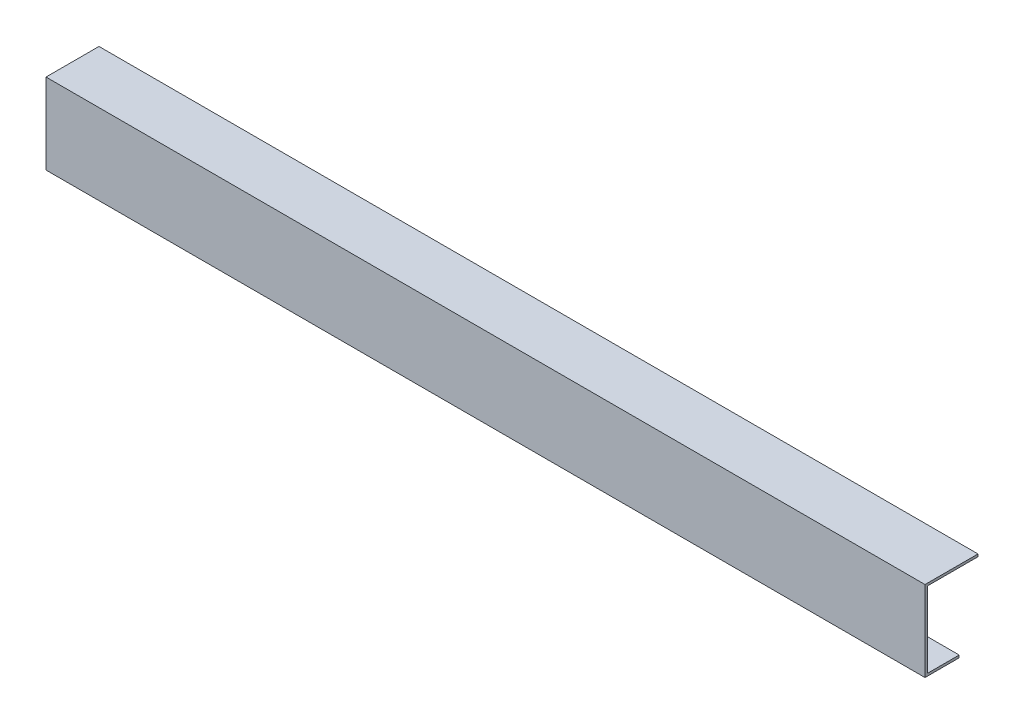
ISO-10303-21;
HEADER;
FILE_DESCRIPTION(('STEP AP214'),'2;1');
FILE_NAME('part.step','',(''),(''),'','','');
FILE_SCHEMA(('AUTOMOTIVE_DESIGN { 1 0 10303 214 1 1 1 1 }'));
ENDSEC;
DATA;
#1=APPLICATION_CONTEXT('core data for automotive mechanical design processes');
#2=APPLICATION_PROTOCOL_DEFINITION('international standard','automotive_design',2000,#1);
#3=PRODUCT_CONTEXT('',#1,'mechanical');
#4=PRODUCT('Part','Part','',(#3));
#5=PRODUCT_RELATED_PRODUCT_CATEGORY('part','',(#4));
#6=PRODUCT_DEFINITION_FORMATION('','',#4);
#7=PRODUCT_DEFINITION_CONTEXT('part definition',#1,'design');
#8=PRODUCT_DEFINITION('design','',#6,#7);
#9=PRODUCT_DEFINITION_SHAPE('','',#8);
#10=(LENGTH_UNIT() NAMED_UNIT(*) SI_UNIT(.MILLI.,.METRE.));
#11=(NAMED_UNIT(*) PLANE_ANGLE_UNIT() SI_UNIT($,.RADIAN.));
#12=(NAMED_UNIT(*) SI_UNIT($,.STERADIAN.) SOLID_ANGLE_UNIT());
#13=UNCERTAINTY_MEASURE_WITH_UNIT(LENGTH_MEASURE(1.E-05),#10,'distance_accuracy_value','');
#14=(GEOMETRIC_REPRESENTATION_CONTEXT(3) GLOBAL_UNCERTAINTY_ASSIGNED_CONTEXT((#13)) GLOBAL_UNIT_ASSIGNED_CONTEXT((#10,
#11,#12)) REPRESENTATION_CONTEXT('',''));
#15=CARTESIAN_POINT('',(0.,0.,0.));
#16=DIRECTION('',(0.,0.,1.));
#17=DIRECTION('',(1.,0.,0.));
#18=AXIS2_PLACEMENT_3D('',#15,#16,#17);
#19=CARTESIAN_POINT('',(0.,0.,55.118));
#20=DIRECTION('',(1.,0.,0.));
#21=DIRECTION('',(0.,0.,-1.));
#22=AXIS2_PLACEMENT_3D('',#19,#20,#21);
#23=PLANE('',#22);
#24=DIRECTION('',(0.,0.,-1.));
#25=VECTOR('',#24,1.);
#26=CARTESIAN_POINT('',(0.,-81.28,19.558));
#27=LINE('',#26,#25);
#28=CARTESIAN_POINT('',(0.,-81.28,52.578));
#29=VERTEX_POINT('',#28);
#30=CARTESIAN_POINT('',(0.,-81.28,19.558));
#31=VERTEX_POINT('',#30);
#32=EDGE_CURVE('E130',#29,#31,#27,.T.);
#33=ORIENTED_EDGE('',*,*,#32,.T.);
#34=DIRECTION('',(0.,-1.,0.));
#35=VECTOR('',#34,1.);
#36=CARTESIAN_POINT('',(0.,-83.82,19.558));
#37=LINE('',#36,#35);
#38=CARTESIAN_POINT('',(0.,-83.82,19.558));
#39=VERTEX_POINT('',#38);
#40=EDGE_CURVE('E144',#31,#39,#37,.T.);
#41=ORIENTED_EDGE('',*,*,#40,.T.);
#42=DIRECTION('',(0.,0.,-1.));
#43=VECTOR('',#42,1.);
#44=CARTESIAN_POINT('',(0.,-83.82,55.118));
#45=LINE('',#44,#43);
#46=CARTESIAN_POINT('',(0.,-83.82,55.118));
#47=VERTEX_POINT('',#46);
#48=EDGE_CURVE('E11',#47,#39,#45,.T.);
#49=ORIENTED_EDGE('',*,*,#48,.F.);
#50=DIRECTION('',(0.,-1.,0.));
#51=VECTOR('',#50,1.);
#52=CARTESIAN_POINT('',(0.,0.,55.118));
#53=LINE('',#52,#51);
#54=CARTESIAN_POINT('',(0.,0.,55.118));
#55=VERTEX_POINT('',#54);
#56=EDGE_CURVE('E167',#55,#47,#53,.T.);
#57=ORIENTED_EDGE('',*,*,#56,.F.);
#58=DIRECTION('',(0.,0.,-1.));
#59=VECTOR('',#58,1.);
#60=CARTESIAN_POINT('',(0.,0.,55.118));
#61=LINE('',#60,#59);
#62=CARTESIAN_POINT('',(0.,0.,0.));
#63=VERTEX_POINT('',#62);
#64=EDGE_CURVE('E177',#55,#63,#61,.T.);
#65=ORIENTED_EDGE('',*,*,#64,.T.);
#66=DIRECTION('',(0.,-1.,0.));
#67=VECTOR('',#66,1.);
#68=CARTESIAN_POINT('',(0.,0.,0.));
#69=LINE('',#68,#67);
#70=CARTESIAN_POINT('',(0.,-2.54,0.));
#71=VERTEX_POINT('',#70);
#72=EDGE_CURVE('E134',#63,#71,#69,.T.);
#73=ORIENTED_EDGE('',*,*,#72,.T.);
#74=DIRECTION('',(0.,0.,1.));
#75=VECTOR('',#74,1.);
#76=CARTESIAN_POINT('',(0.,-2.54,52.578));
#77=LINE('',#76,#75);
#78=CARTESIAN_POINT('',(0.,-2.54,52.578));
#79=VERTEX_POINT('',#78);
#80=EDGE_CURVE('E54',#71,#79,#77,.T.);
#81=ORIENTED_EDGE('',*,*,#80,.T.);
#82=DIRECTION('',(0.,-1.,0.));
#83=VECTOR('',#82,1.);
#84=CARTESIAN_POINT('',(0.,-81.28,52.578));
#85=LINE('',#84,#83);
#86=EDGE_CURVE('E124',#79,#29,#85,.T.);
#87=ORIENTED_EDGE('',*,*,#86,.T.);
#88=EDGE_LOOP('',(#33,#41,#49,#57,#65,#73,#81,#87));
#89=FACE_BOUND('',#88,.T.);
#90=ADVANCED_FACE('F39',(#89),#23,.F.);
#91=CARTESIAN_POINT('',(0.,-83.82,55.118));
#92=DIRECTION('',(0.,1.,0.));
#93=DIRECTION('',(0.,0.,1.));
#94=AXIS2_PLACEMENT_3D('',#91,#92,#93);
#95=PLANE('',#94);
#96=ORIENTED_EDGE('',*,*,#48,.T.);
#97=DIRECTION('',(1.,0.,0.));
#98=VECTOR('',#97,1.);
#99=CARTESIAN_POINT('',(0.,-83.82,19.558));
#100=LINE('',#99,#98);
#101=CARTESIAN_POINT('',(914.4,-83.82,19.558));
#102=VERTEX_POINT('',#101);
#103=EDGE_CURVE('E156',#39,#102,#100,.T.);
#104=ORIENTED_EDGE('',*,*,#103,.T.);
#105=DIRECTION('',(0.,0.,-1.));
#106=VECTOR('',#105,1.);
#107=CARTESIAN_POINT('',(914.4,-83.82,55.118));
#108=LINE('',#107,#106);
#109=CARTESIAN_POINT('',(914.4,-83.82,55.118));
#110=VERTEX_POINT('',#109);
#111=EDGE_CURVE('E47',#110,#102,#108,.T.);
#112=ORIENTED_EDGE('',*,*,#111,.F.);
#113=DIRECTION('',(1.,0.,0.));
#114=VECTOR('',#113,1.);
#115=CARTESIAN_POINT('',(0.,-83.82,55.118));
#116=LINE('',#115,#114);
#117=EDGE_CURVE('E85',#47,#110,#116,.T.);
#118=ORIENTED_EDGE('',*,*,#117,.F.);
#119=EDGE_LOOP('',(#96,#104,#112,#118));
#120=FACE_BOUND('',#119,.T.);
#121=ADVANCED_FACE('F197',(#120),#95,.F.);
#122=CARTESIAN_POINT('',(914.4,0.,55.118));
#123=DIRECTION('',(-1.,0.,0.));
#124=DIRECTION('',(0.,0.,1.));
#125=AXIS2_PLACEMENT_3D('',#122,#123,#124);
#126=PLANE('',#125);
#127=ORIENTED_EDGE('',*,*,#111,.T.);
#128=DIRECTION('',(0.,-1.,0.));
#129=VECTOR('',#128,1.);
#130=CARTESIAN_POINT('',(914.4,-83.82,19.558));
#131=LINE('',#130,#129);
#132=CARTESIAN_POINT('',(914.4,-81.28,19.558));
#133=VERTEX_POINT('',#132);
#134=EDGE_CURVE('E136',#133,#102,#131,.T.);
#135=ORIENTED_EDGE('',*,*,#134,.F.);
#136=DIRECTION('',(0.,0.,-1.));
#137=VECTOR('',#136,1.);
#138=CARTESIAN_POINT('',(914.4,-81.28,19.558));
#139=LINE('',#138,#137);
#140=CARTESIAN_POINT('',(914.4,-81.28,52.578));
#141=VERTEX_POINT('',#140);
#142=EDGE_CURVE('E139',#141,#133,#139,.T.);
#143=ORIENTED_EDGE('',*,*,#142,.F.);
#144=DIRECTION('',(0.,-1.,0.));
#145=VECTOR('',#144,1.);
#146=CARTESIAN_POINT('',(914.4,-81.28,52.578));
#147=LINE('',#146,#145);
#148=CARTESIAN_POINT('',(914.4,-2.54,52.578));
#149=VERTEX_POINT('',#148);
#150=EDGE_CURVE('E150',#149,#141,#147,.T.);
#151=ORIENTED_EDGE('',*,*,#150,.F.);
#152=DIRECTION('',(0.,0.,1.));
#153=VECTOR('',#152,1.);
#154=CARTESIAN_POINT('',(914.4,-2.54,52.578));
#155=LINE('',#154,#153);
#156=CARTESIAN_POINT('',(914.4,-2.54,0.));
#157=VERTEX_POINT('',#156);
#158=EDGE_CURVE('E115',#157,#149,#155,.T.);
#159=ORIENTED_EDGE('',*,*,#158,.F.);
#160=DIRECTION('',(0.,1.,0.));
#161=VECTOR('',#160,1.);
#162=CARTESIAN_POINT('',(914.4,0.,0.));
#163=LINE('',#162,#161);
#164=CARTESIAN_POINT('',(914.4,0.,0.));
#165=VERTEX_POINT('',#164);
#166=EDGE_CURVE('E180',#157,#165,#163,.T.);
#167=ORIENTED_EDGE('',*,*,#166,.T.);
#168=DIRECTION('',(0.,0.,-1.));
#169=VECTOR('',#168,1.);
#170=CARTESIAN_POINT('',(914.4,0.,55.118));
#171=LINE('',#170,#169);
#172=CARTESIAN_POINT('',(914.4,0.,55.118));
#173=VERTEX_POINT('',#172);
#174=EDGE_CURVE('E187',#173,#165,#171,.T.);
#175=ORIENTED_EDGE('',*,*,#174,.F.);
#176=DIRECTION('',(0.,1.,0.));
#177=VECTOR('',#176,1.);
#178=CARTESIAN_POINT('',(914.4,0.,55.118));
#179=LINE('',#178,#177);
#180=EDGE_CURVE('E172',#110,#173,#179,.T.);
#181=ORIENTED_EDGE('',*,*,#180,.F.);
#182=EDGE_LOOP('',(#127,#135,#143,#151,#159,#167,#175,#181));
#183=FACE_BOUND('',#182,.T.);
#184=ADVANCED_FACE('F194',(#183),#126,.F.);
#185=CARTESIAN_POINT('',(0.,0.,55.118));
#186=DIRECTION('',(0.,-1.,0.));
#187=DIRECTION('',(0.,0.,-1.));
#188=AXIS2_PLACEMENT_3D('',#185,#186,#187);
#189=PLANE('',#188);
#190=DIRECTION('',(-1.,0.,0.));
#191=VECTOR('',#190,1.);
#192=CARTESIAN_POINT('',(0.,0.,0.));
#193=LINE('',#192,#191);
#194=EDGE_CURVE('E78',#165,#63,#193,.T.);
#195=ORIENTED_EDGE('',*,*,#194,.T.);
#196=ORIENTED_EDGE('',*,*,#64,.F.);
#197=DIRECTION('',(-1.,0.,0.));
#198=VECTOR('',#197,1.);
#199=CARTESIAN_POINT('',(0.,0.,55.118));
#200=LINE('',#199,#198);
#201=EDGE_CURVE('E63',#173,#55,#200,.T.);
#202=ORIENTED_EDGE('',*,*,#201,.F.);
#203=ORIENTED_EDGE('',*,*,#174,.T.);
#204=EDGE_LOOP('',(#195,#196,#202,#203));
#205=FACE_BOUND('',#204,.T.);
#206=ADVANCED_FACE('F216',(#205),#189,.F.);
#207=CARTESIAN_POINT('',(0.,0.,55.118));
#208=DIRECTION('',(0.,0.,1.));
#209=DIRECTION('',(1.,0.,0.));
#210=AXIS2_PLACEMENT_3D('',#207,#208,#209);
#211=PLANE('',#210);
#212=ORIENTED_EDGE('',*,*,#56,.T.);
#213=ORIENTED_EDGE('',*,*,#117,.T.);
#214=ORIENTED_EDGE('',*,*,#180,.T.);
#215=ORIENTED_EDGE('',*,*,#201,.T.);
#216=EDGE_LOOP('',(#212,#213,#214,#215));
#217=FACE_BOUND('',#216,.T.);
#218=ADVANCED_FACE('F209',(#217),#211,.T.);
#219=CARTESIAN_POINT('',(0.,0.,0.));
#220=DIRECTION('',(0.,0.,1.));
#221=DIRECTION('',(1.,0.,0.));
#222=AXIS2_PLACEMENT_3D('',#219,#220,#221);
#223=PLANE('',#222);
#224=ORIENTED_EDGE('',*,*,#166,.F.);
#225=DIRECTION('',(1.,0.,0.));
#226=VECTOR('',#225,1.);
#227=CARTESIAN_POINT('',(0.,-2.54,0.));
#228=LINE('',#227,#226);
#229=EDGE_CURVE('E121',#71,#157,#228,.T.);
#230=ORIENTED_EDGE('',*,*,#229,.F.);
#231=ORIENTED_EDGE('',*,*,#72,.F.);
#232=ORIENTED_EDGE('',*,*,#194,.F.);
#233=EDGE_LOOP('',(#224,#230,#231,#232));
#234=FACE_BOUND('',#233,.T.);
#235=ADVANCED_FACE('F207',(#234),#223,.F.);
#236=CARTESIAN_POINT('',(0.,-83.82,19.558));
#237=DIRECTION('',(0.,0.,1.));
#238=DIRECTION('',(1.,0.,0.));
#239=AXIS2_PLACEMENT_3D('',#236,#237,#238);
#240=PLANE('',#239);
#241=ORIENTED_EDGE('',*,*,#134,.T.);
#242=ORIENTED_EDGE('',*,*,#103,.F.);
#243=ORIENTED_EDGE('',*,*,#40,.F.);
#244=DIRECTION('',(1.,0.,0.));
#245=VECTOR('',#244,1.);
#246=CARTESIAN_POINT('',(0.,-81.28,19.558));
#247=LINE('',#246,#245);
#248=EDGE_CURVE('E160',#31,#133,#247,.T.);
#249=ORIENTED_EDGE('',*,*,#248,.T.);
#250=EDGE_LOOP('',(#241,#242,#243,#249));
#251=FACE_BOUND('',#250,.T.);
#252=ADVANCED_FACE('F201',(#251),#240,.F.);
#253=CARTESIAN_POINT('',(0.,-81.28,19.558));
#254=DIRECTION('',(0.,-1.,0.));
#255=DIRECTION('',(0.,0.,-1.));
#256=AXIS2_PLACEMENT_3D('',#253,#254,#255);
#257=PLANE('',#256);
#258=ORIENTED_EDGE('',*,*,#142,.T.);
#259=ORIENTED_EDGE('',*,*,#248,.F.);
#260=ORIENTED_EDGE('',*,*,#32,.F.);
#261=DIRECTION('',(1.,0.,0.));
#262=VECTOR('',#261,1.);
#263=CARTESIAN_POINT('',(0.,-81.28,52.578));
#264=LINE('',#263,#262);
#265=EDGE_CURVE('E120',#29,#141,#264,.T.);
#266=ORIENTED_EDGE('',*,*,#265,.T.);
#267=EDGE_LOOP('',(#258,#259,#260,#266));
#268=FACE_BOUND('',#267,.T.);
#269=ADVANCED_FACE('F204',(#268),#257,.F.);
#270=CARTESIAN_POINT('',(0.,-81.28,52.578));
#271=DIRECTION('',(0.,0.,1.));
#272=DIRECTION('',(1.,0.,0.));
#273=AXIS2_PLACEMENT_3D('',#270,#271,#272);
#274=PLANE('',#273);
#275=ORIENTED_EDGE('',*,*,#150,.T.);
#276=ORIENTED_EDGE('',*,*,#265,.F.);
#277=ORIENTED_EDGE('',*,*,#86,.F.);
#278=DIRECTION('',(1.,0.,0.));
#279=VECTOR('',#278,1.);
#280=CARTESIAN_POINT('',(0.,-2.54,52.578));
#281=LINE('',#280,#279);
#282=EDGE_CURVE('E111',#79,#149,#281,.T.);
#283=ORIENTED_EDGE('',*,*,#282,.T.);
#284=EDGE_LOOP('',(#275,#276,#277,#283));
#285=FACE_BOUND('',#284,.T.);
#286=ADVANCED_FACE('F125',(#285),#274,.F.);
#287=CARTESIAN_POINT('',(0.,-2.54,52.578));
#288=DIRECTION('',(0.,1.,0.));
#289=DIRECTION('',(0.,0.,1.));
#290=AXIS2_PLACEMENT_3D('',#287,#288,#289);
#291=PLANE('',#290);
#292=ORIENTED_EDGE('',*,*,#158,.T.);
#293=ORIENTED_EDGE('',*,*,#282,.F.);
#294=ORIENTED_EDGE('',*,*,#80,.F.);
#295=ORIENTED_EDGE('',*,*,#229,.T.);
#296=EDGE_LOOP('',(#292,#293,#294,#295));
#297=FACE_BOUND('',#296,.T.);
#298=ADVANCED_FACE('F113',(#297),#291,.F.);
#299=CLOSED_SHELL('',(#90,#121,#184,#206,#218,#235,#252,#269,#286,#298));
#300=MANIFOLD_SOLID_BREP('B2',#299);
#301=ADVANCED_BREP_SHAPE_REPRESENTATION('',(#18,#300),#14);
#302=SHAPE_DEFINITION_REPRESENTATION(#9,#301);
ENDSEC;
END-ISO-10303-21;
